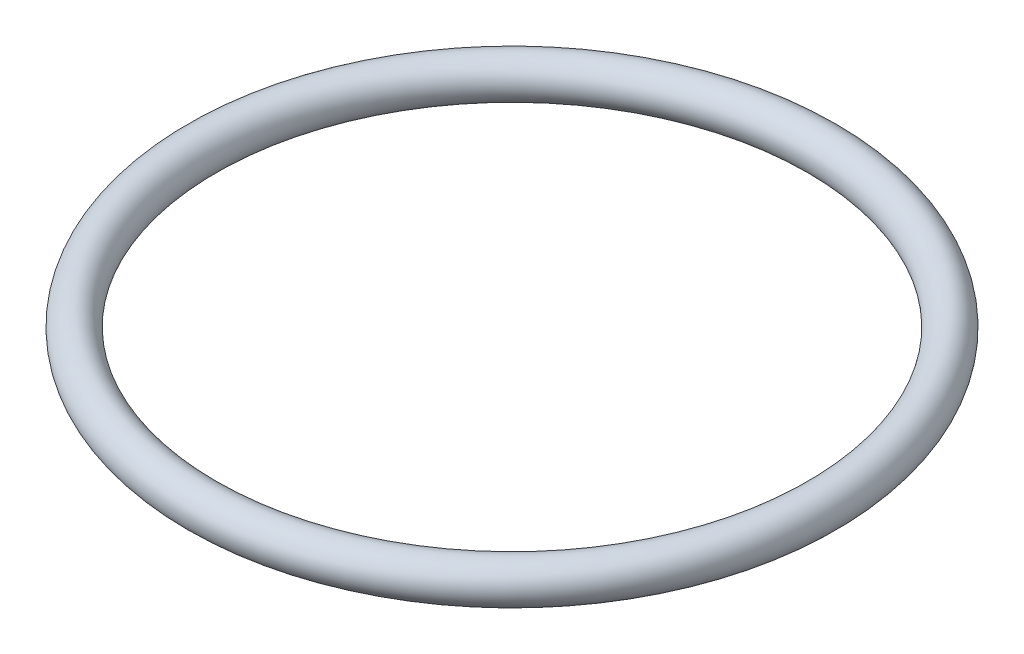
ISO-10303-21;
HEADER;
FILE_DESCRIPTION(('STEP AP214'),'2;1');
FILE_NAME('part.step','',(''),(''),'','','');
FILE_SCHEMA(('AUTOMOTIVE_DESIGN { 1 0 10303 214 1 1 1 1 }'));
ENDSEC;
DATA;
#1=APPLICATION_CONTEXT('core data for automotive mechanical design processes');
#2=APPLICATION_PROTOCOL_DEFINITION('international standard','automotive_design',2000,#1);
#3=PRODUCT_CONTEXT('',#1,'mechanical');
#4=PRODUCT('Part','Part','',(#3));
#5=PRODUCT_RELATED_PRODUCT_CATEGORY('part','',(#4));
#6=PRODUCT_DEFINITION_FORMATION('','',#4);
#7=PRODUCT_DEFINITION_CONTEXT('part definition',#1,'design');
#8=PRODUCT_DEFINITION('design','',#6,#7);
#9=PRODUCT_DEFINITION_SHAPE('','',#8);
#10=(LENGTH_UNIT() NAMED_UNIT(*) SI_UNIT(.MILLI.,.METRE.));
#11=(NAMED_UNIT(*) PLANE_ANGLE_UNIT() SI_UNIT($,.RADIAN.));
#12=(NAMED_UNIT(*) SI_UNIT($,.STERADIAN.) SOLID_ANGLE_UNIT());
#13=UNCERTAINTY_MEASURE_WITH_UNIT(LENGTH_MEASURE(1.E-05),#10,'distance_accuracy_value','');
#14=(GEOMETRIC_REPRESENTATION_CONTEXT(3) GLOBAL_UNCERTAINTY_ASSIGNED_CONTEXT((#13)) GLOBAL_UNIT_ASSIGNED_CONTEXT((#10,
#11,#12)) REPRESENTATION_CONTEXT('',''));
#15=CARTESIAN_POINT('',(0.,0.,0.));
#16=DIRECTION('',(0.,0.,1.));
#17=DIRECTION('',(1.,0.,0.));
#18=AXIS2_PLACEMENT_3D('',#15,#16,#17);
#19=CARTESIAN_POINT('',(0.,0.,0.));
#20=DIRECTION('',(0.,-1.,0.));
#21=DIRECTION('',(0.,0.,-1.));
#22=AXIS2_PLACEMENT_3D('',#19,#20,#21);
#23=TOROIDAL_SURFACE('',#22,19.45,1.25);
#24=CARTESIAN_POINT('',(0.,0.,-20.7));
#25=VERTEX_POINT('',#24);
#26=VERTEX_LOOP('',#25);
#27=FACE_BOUND('',#26,.T.);
#28=ADVANCED_FACE('F34',(#27),#23,.T.);
#29=CLOSED_SHELL('',(#28));
#30=MANIFOLD_SOLID_BREP('B2',#29);
#31=ADVANCED_BREP_SHAPE_REPRESENTATION('',(#18,#30),#14);
#32=SHAPE_DEFINITION_REPRESENTATION(#9,#31);
ENDSEC;
END-ISO-10303-21;
